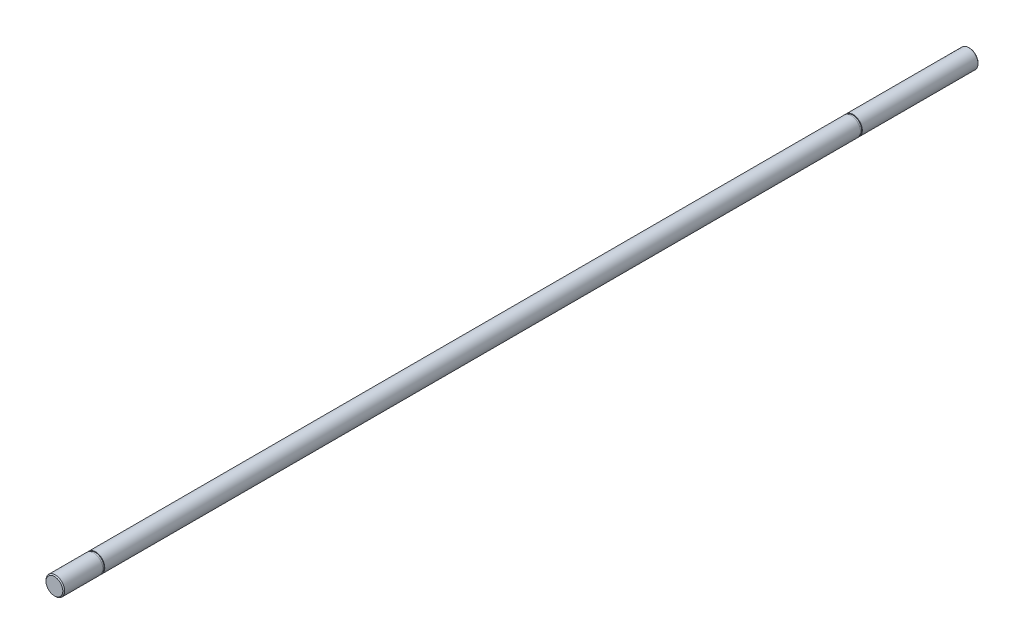
ISO-10303-21;
HEADER;
FILE_DESCRIPTION(('STEP AP214'),'2;1');
FILE_NAME('part.step','',(''),(''),'','','');
FILE_SCHEMA(('AUTOMOTIVE_DESIGN { 1 0 10303 214 1 1 1 1 }'));
ENDSEC;
DATA;
#1=APPLICATION_CONTEXT('core data for automotive mechanical design processes');
#2=APPLICATION_PROTOCOL_DEFINITION('international standard','automotive_design',2000,#1);
#3=PRODUCT_CONTEXT('',#1,'mechanical');
#4=PRODUCT('Part','Part','',(#3));
#5=PRODUCT_RELATED_PRODUCT_CATEGORY('part','',(#4));
#6=PRODUCT_DEFINITION_FORMATION('','',#4);
#7=PRODUCT_DEFINITION_CONTEXT('part definition',#1,'design');
#8=PRODUCT_DEFINITION('design','',#6,#7);
#9=PRODUCT_DEFINITION_SHAPE('','',#8);
#10=(LENGTH_UNIT() NAMED_UNIT(*) SI_UNIT(.MILLI.,.METRE.));
#11=(NAMED_UNIT(*) PLANE_ANGLE_UNIT() SI_UNIT($,.RADIAN.));
#12=(NAMED_UNIT(*) SI_UNIT($,.STERADIAN.) SOLID_ANGLE_UNIT());
#13=UNCERTAINTY_MEASURE_WITH_UNIT(LENGTH_MEASURE(1.E-05),#10,'distance_accuracy_value','');
#14=(GEOMETRIC_REPRESENTATION_CONTEXT(3) GLOBAL_UNCERTAINTY_ASSIGNED_CONTEXT((#13)) GLOBAL_UNIT_ASSIGNED_CONTEXT((#10,
#11,#12)) REPRESENTATION_CONTEXT('',''));
#15=CARTESIAN_POINT('',(0.,0.,0.));
#16=DIRECTION('',(0.,0.,1.));
#17=DIRECTION('',(1.,0.,0.));
#18=AXIS2_PLACEMENT_3D('',#15,#16,#17);
#19=CARTESIAN_POINT('',(0.,0.,532.));
#20=DIRECTION('',(0.,0.,-1.));
#21=DIRECTION('',(-1.,0.,0.));
#22=AXIS2_PLACEMENT_3D('',#19,#20,#21);
#23=CYLINDRICAL_SURFACE('',#22,5.);
#24=CARTESIAN_POINT('',(0.,0.,468.5));
#25=DIRECTION('',(0.,0.,1.));
#26=DIRECTION('',(1.,0.,0.));
#27=AXIS2_PLACEMENT_3D('',#24,#25,#26);
#28=CIRCLE('',#27,5.);
#29=CARTESIAN_POINT('',(5.,0.,468.5));
#30=VERTEX_POINT('',#29);
#31=EDGE_CURVE('E52',#30,#30,#28,.T.);
#32=ORIENTED_EDGE('',*,*,#31,.F.);
#33=EDGE_LOOP('',(#32));
#34=FACE_BOUND('',#33,.T.);
#35=CARTESIAN_POINT('',(0.,0.,63.5));
#36=DIRECTION('',(0.,0.,-1.));
#37=DIRECTION('',(-1.,0.,0.));
#38=AXIS2_PLACEMENT_3D('',#35,#36,#37);
#39=CIRCLE('',#38,5.);
#40=CARTESIAN_POINT('',(-5.,0.,63.5));
#41=VERTEX_POINT('',#40);
#42=EDGE_CURVE('E53',#41,#41,#39,.T.);
#43=ORIENTED_EDGE('',*,*,#42,.F.);
#44=EDGE_LOOP('',(#43));
#45=FACE_BOUND('',#44,.T.);
#46=ADVANCED_FACE('F32',(#34,#45),#23,.T.);
#47=CARTESIAN_POINT('',(-8.08195358023569,0.,468.5));
#48=DIRECTION('',(0.,0.,1.));
#49=DIRECTION('',(1.,0.,0.));
#50=AXIS2_PLACEMENT_3D('',#47,#48,#49);
#51=PLANE('',#50);
#52=CARTESIAN_POINT('',(0.,0.,468.5));
#53=DIRECTION('',(0.,0.,1.));
#54=DIRECTION('',(1.,0.,0.));
#55=AXIS2_PLACEMENT_3D('',#52,#53,#54);
#56=CIRCLE('',#55,4.65);
#57=CARTESIAN_POINT('',(4.65,0.,468.5));
#58=VERTEX_POINT('',#57);
#59=EDGE_CURVE('E66',#58,#58,#56,.T.);
#60=ORIENTED_EDGE('',*,*,#59,.F.);
#61=EDGE_LOOP('',(#60));
#62=FACE_BOUND('',#61,.T.);
#63=ORIENTED_EDGE('',*,*,#31,.T.);
#64=EDGE_LOOP('',(#63));
#65=FACE_BOUND('',#64,.T.);
#66=ADVANCED_FACE('F105',(#62,#65),#51,.T.);
#67=CARTESIAN_POINT('',(-8.08195358023569,0.,469.5));
#68=DIRECTION('',(0.,0.,-1.));
#69=DIRECTION('',(-1.,0.,0.));
#70=AXIS2_PLACEMENT_3D('',#67,#68,#69);
#71=PLANE('',#70);
#72=CARTESIAN_POINT('',(0.,0.,469.5));
#73=DIRECTION('',(0.,0.,1.));
#74=DIRECTION('',(1.,0.,0.));
#75=AXIS2_PLACEMENT_3D('',#72,#73,#74);
#76=CIRCLE('',#75,4.65);
#77=CARTESIAN_POINT('',(4.65,0.,469.5));
#78=VERTEX_POINT('',#77);
#79=EDGE_CURVE('E56',#78,#78,#76,.T.);
#80=ORIENTED_EDGE('',*,*,#79,.T.);
#81=EDGE_LOOP('',(#80));
#82=FACE_BOUND('',#81,.T.);
#83=CARTESIAN_POINT('',(0.,0.,469.5));
#84=DIRECTION('',(0.,0.,-1.));
#85=DIRECTION('',(-1.,0.,0.));
#86=AXIS2_PLACEMENT_3D('',#83,#84,#85);
#87=CIRCLE('',#86,5.);
#88=CARTESIAN_POINT('',(-5.,0.,469.5));
#89=VERTEX_POINT('',#88);
#90=EDGE_CURVE('E63',#89,#89,#87,.T.);
#91=ORIENTED_EDGE('',*,*,#90,.T.);
#92=EDGE_LOOP('',(#91));
#93=FACE_BOUND('',#92,.T.);
#94=ADVANCED_FACE('F110',(#82,#93),#71,.T.);
#95=CARTESIAN_POINT('',(0.,0.,532.));
#96=DIRECTION('',(0.,0.,1.));
#97=DIRECTION('',(1.,0.,0.));
#98=AXIS2_PLACEMENT_3D('',#95,#96,#97);
#99=CYLINDRICAL_SURFACE('',#98,4.65);
#100=ORIENTED_EDGE('',*,*,#59,.T.);
#101=EDGE_LOOP('',(#100));
#102=FACE_BOUND('',#101,.T.);
#103=ORIENTED_EDGE('',*,*,#79,.F.);
#104=EDGE_LOOP('',(#103));
#105=FACE_BOUND('',#104,.T.);
#106=ADVANCED_FACE('F103',(#102,#105),#99,.T.);
#107=CARTESIAN_POINT('',(0.,0.,490.));
#108=DIRECTION('',(0.,0.,-1.));
#109=DIRECTION('',(-1.,0.,0.));
#110=AXIS2_PLACEMENT_3D('',#107,#108,#109);
#111=CIRCLE('',#110,5.);
#112=CARTESIAN_POINT('',(-5.,0.,490.));
#113=VERTEX_POINT('',#112);
#114=EDGE_CURVE('E39',#113,#113,#111,.T.);
#115=ORIENTED_EDGE('',*,*,#114,.T.);
#116=EDGE_LOOP('',(#115));
#117=FACE_BOUND('',#116,.T.);
#118=ORIENTED_EDGE('',*,*,#90,.F.);
#119=EDGE_LOOP('',(#118));
#120=FACE_BOUND('',#119,.T.);
#121=ADVANCED_FACE('F93',(#117,#120),#23,.T.);
#122=CARTESIAN_POINT('',(-9.28262312497964,0.,63.5));
#123=DIRECTION('',(0.,0.,-1.));
#124=DIRECTION('',(-1.,0.,0.));
#125=AXIS2_PLACEMENT_3D('',#122,#123,#124);
#126=PLANE('',#125);
#127=CARTESIAN_POINT('',(0.,0.,63.5));
#128=DIRECTION('',(0.,0.,1.));
#129=DIRECTION('',(1.,0.,0.));
#130=AXIS2_PLACEMENT_3D('',#127,#128,#129);
#131=CIRCLE('',#130,4.65);
#132=CARTESIAN_POINT('',(4.65,0.,63.5));
#133=VERTEX_POINT('',#132);
#134=EDGE_CURVE('E60',#133,#133,#131,.T.);
#135=ORIENTED_EDGE('',*,*,#134,.T.);
#136=EDGE_LOOP('',(#135));
#137=FACE_BOUND('',#136,.T.);
#138=ORIENTED_EDGE('',*,*,#42,.T.);
#139=EDGE_LOOP('',(#138));
#140=FACE_BOUND('',#139,.T.);
#141=ADVANCED_FACE('F83',(#137,#140),#126,.T.);
#142=CARTESIAN_POINT('',(-9.28262312497964,0.,62.5));
#143=DIRECTION('',(0.,0.,1.));
#144=DIRECTION('',(1.,0.,0.));
#145=AXIS2_PLACEMENT_3D('',#142,#143,#144);
#146=PLANE('',#145);
#147=CARTESIAN_POINT('',(0.,0.,62.5));
#148=DIRECTION('',(0.,0.,1.));
#149=DIRECTION('',(1.,0.,0.));
#150=AXIS2_PLACEMENT_3D('',#147,#148,#149);
#151=CIRCLE('',#150,4.65);
#152=CARTESIAN_POINT('',(4.65,0.,62.5));
#153=VERTEX_POINT('',#152);
#154=EDGE_CURVE('E73',#153,#153,#151,.T.);
#155=ORIENTED_EDGE('',*,*,#154,.F.);
#156=EDGE_LOOP('',(#155));
#157=FACE_BOUND('',#156,.T.);
#158=CARTESIAN_POINT('',(0.,0.,62.5));
#159=DIRECTION('',(0.,0.,1.));
#160=DIRECTION('',(1.,0.,0.));
#161=AXIS2_PLACEMENT_3D('',#158,#159,#160);
#162=CIRCLE('',#161,5.);
#163=CARTESIAN_POINT('',(5.,0.,62.5));
#164=VERTEX_POINT('',#163);
#165=EDGE_CURVE('E57',#164,#164,#162,.T.);
#166=ORIENTED_EDGE('',*,*,#165,.T.);
#167=EDGE_LOOP('',(#166));
#168=FACE_BOUND('',#167,.T.);
#169=ADVANCED_FACE('F80',(#157,#168),#146,.T.);
#170=CARTESIAN_POINT('',(0.,0.,532.));
#171=DIRECTION('',(0.,0.,1.));
#172=DIRECTION('',(1.,0.,0.));
#173=AXIS2_PLACEMENT_3D('',#170,#171,#172);
#174=CYLINDRICAL_SURFACE('',#173,4.65);
#175=ORIENTED_EDGE('',*,*,#154,.T.);
#176=EDGE_LOOP('',(#175));
#177=FACE_BOUND('',#176,.T.);
#178=ORIENTED_EDGE('',*,*,#134,.F.);
#179=EDGE_LOOP('',(#178));
#180=FACE_BOUND('',#179,.T.);
#181=ADVANCED_FACE('F77',(#177,#180),#174,.T.);
#182=CARTESIAN_POINT('',(0.,0.,0.));
#183=DIRECTION('',(0.,0.,1.));
#184=DIRECTION('',(1.,0.,0.));
#185=AXIS2_PLACEMENT_3D('',#182,#183,#184);
#186=PLANE('',#185);
#187=CARTESIAN_POINT('',(0.,0.,0.));
#188=DIRECTION('',(0.,0.,1.));
#189=DIRECTION('',(1.,0.,0.));
#190=AXIS2_PLACEMENT_3D('',#187,#188,#189);
#191=CIRCLE('',#190,4.5);
#192=CARTESIAN_POINT('',(4.5,0.,0.));
#193=VERTEX_POINT('',#192);
#194=EDGE_CURVE('E43',#193,#193,#191,.F.);
#195=ORIENTED_EDGE('',*,*,#194,.T.);
#196=EDGE_LOOP('',(#195));
#197=FACE_BOUND('',#196,.T.);
#198=ADVANCED_FACE('F90',(#197),#186,.F.);
#199=CARTESIAN_POINT('',(0.,0.,0.499999999999945));
#200=DIRECTION('',(0.,0.,1.));
#201=DIRECTION('',(1.,0.,0.));
#202=AXIS2_PLACEMENT_3D('',#199,#200,#201);
#203=CIRCLE('',#202,5.);
#204=CARTESIAN_POINT('',(5.,0.,0.499999999999945));
#205=VERTEX_POINT('',#204);
#206=EDGE_CURVE('E47',#205,#205,#203,.T.);
#207=ORIENTED_EDGE('',*,*,#206,.T.);
#208=EDGE_LOOP('',(#207));
#209=FACE_BOUND('',#208,.T.);
#210=ORIENTED_EDGE('',*,*,#165,.F.);
#211=EDGE_LOOP('',(#210));
#212=FACE_BOUND('',#211,.T.);
#213=ADVANCED_FACE('F87',(#209,#212),#23,.T.);
#214=CARTESIAN_POINT('',(0.,0.,0.499999999999945));
#215=DIRECTION('',(0.,0.,1.));
#216=DIRECTION('',(1.,0.,0.));
#217=AXIS2_PLACEMENT_3D('',#214,#215,#216);
#218=CONICAL_SURFACE('',#217,5.,0.7853981633975);
#219=ORIENTED_EDGE('',*,*,#194,.F.);
#220=EDGE_LOOP('',(#219));
#221=FACE_BOUND('',#220,.T.);
#222=ORIENTED_EDGE('',*,*,#206,.F.);
#223=EDGE_LOOP('',(#222));
#224=FACE_BOUND('',#223,.T.);
#225=ADVANCED_FACE('F89',(#221,#224),#218,.T.);
#226=CARTESIAN_POINT('',(-11.9106459177772,-10.,490.5));
#227=DIRECTION('',(0.,0.,-1.));
#228=DIRECTION('',(-1.,0.,0.));
#229=AXIS2_PLACEMENT_3D('',#226,#227,#228);
#230=PLANE('',#229);
#231=CARTESIAN_POINT('',(0.,0.,490.5));
#232=DIRECTION('',(0.,0.,-1.));
#233=DIRECTION('',(-1.,0.,0.));
#234=AXIS2_PLACEMENT_3D('',#231,#232,#233);
#235=CIRCLE('',#234,4.5);
#236=CARTESIAN_POINT('',(-4.5,0.,490.5));
#237=VERTEX_POINT('',#236);
#238=EDGE_CURVE('E10',#237,#237,#235,.F.);
#239=ORIENTED_EDGE('',*,*,#238,.T.);
#240=EDGE_LOOP('',(#239));
#241=FACE_BOUND('',#240,.T.);
#242=ADVANCED_FACE('F98',(#241),#230,.F.);
#243=CARTESIAN_POINT('',(0.,0.,490.));
#244=DIRECTION('',(0.,0.,-1.));
#245=DIRECTION('',(-1.,0.,0.));
#246=AXIS2_PLACEMENT_3D('',#243,#244,#245);
#247=CONICAL_SURFACE('',#246,5.,0.7853981633975);
#248=ORIENTED_EDGE('',*,*,#238,.F.);
#249=EDGE_LOOP('',(#248));
#250=FACE_BOUND('',#249,.T.);
#251=ORIENTED_EDGE('',*,*,#114,.F.);
#252=EDGE_LOOP('',(#251));
#253=FACE_BOUND('',#252,.T.);
#254=ADVANCED_FACE('F34',(#250,#253),#247,.T.);
#255=CLOSED_SHELL('',(#46,#66,#94,#106,#121,#141,#169,#181,#198,#213,#225,#242,#254));
#256=MANIFOLD_SOLID_BREP('B2',#255);
#257=ADVANCED_BREP_SHAPE_REPRESENTATION('',(#18,#256),#14);
#258=SHAPE_DEFINITION_REPRESENTATION(#9,#257);
ENDSEC;
END-ISO-10303-21;
